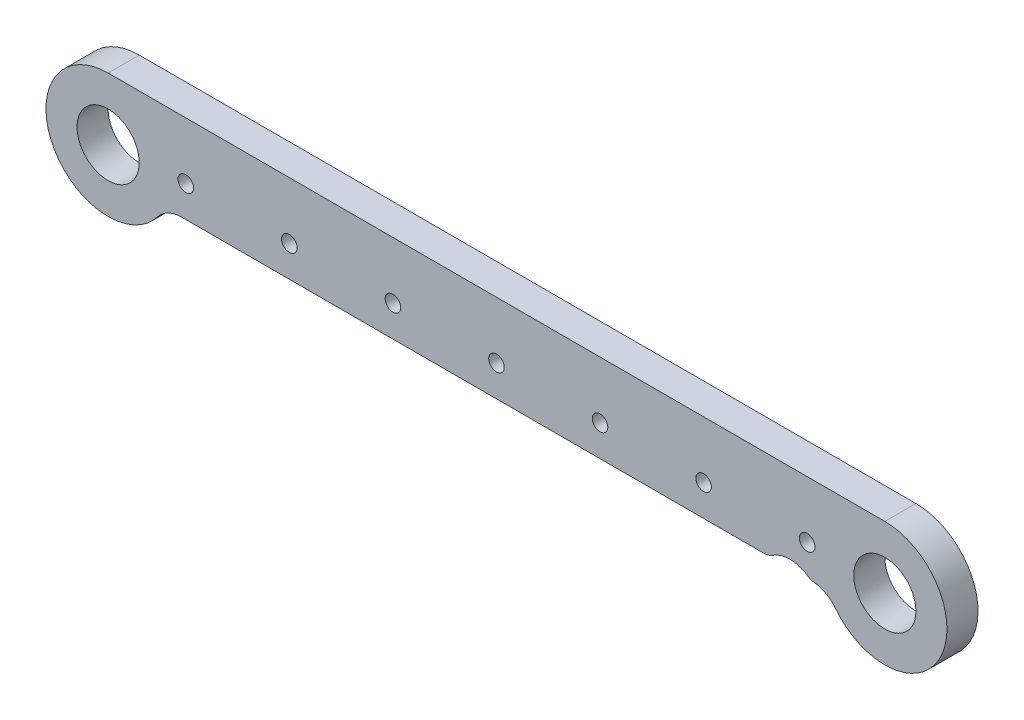
ISO-10303-21;
HEADER;
FILE_DESCRIPTION(('STEP AP214'),'2;1');
FILE_NAME('part.step','',(''),(''),'','','');
FILE_SCHEMA(('AUTOMOTIVE_DESIGN { 1 0 10303 214 1 1 1 1 }'));
ENDSEC;
DATA;
#1=APPLICATION_CONTEXT('core data for automotive mechanical design processes');
#2=APPLICATION_PROTOCOL_DEFINITION('international standard','automotive_design',2000,#1);
#3=PRODUCT_CONTEXT('',#1,'mechanical');
#4=PRODUCT('Part','Part','',(#3));
#5=PRODUCT_RELATED_PRODUCT_CATEGORY('part','',(#4));
#6=PRODUCT_DEFINITION_FORMATION('','',#4);
#7=PRODUCT_DEFINITION_CONTEXT('part definition',#1,'design');
#8=PRODUCT_DEFINITION('design','',#6,#7);
#9=PRODUCT_DEFINITION_SHAPE('','',#8);
#10=(LENGTH_UNIT() NAMED_UNIT(*) SI_UNIT(.MILLI.,.METRE.));
#11=(NAMED_UNIT(*) PLANE_ANGLE_UNIT() SI_UNIT($,.RADIAN.));
#12=(NAMED_UNIT(*) SI_UNIT($,.STERADIAN.) SOLID_ANGLE_UNIT());
#13=UNCERTAINTY_MEASURE_WITH_UNIT(LENGTH_MEASURE(1.E-05),#10,'distance_accuracy_value','');
#14=(GEOMETRIC_REPRESENTATION_CONTEXT(3) GLOBAL_UNCERTAINTY_ASSIGNED_CONTEXT((#13)) GLOBAL_UNIT_ASSIGNED_CONTEXT((#10,
#11,#12)) REPRESENTATION_CONTEXT('',''));
#15=CARTESIAN_POINT('',(0.,0.,0.));
#16=DIRECTION('',(0.,0.,1.));
#17=DIRECTION('',(1.,0.,0.));
#18=AXIS2_PLACEMENT_3D('',#15,#16,#17);
#19=CARTESIAN_POINT('',(0.,0.,6.));
#20=DIRECTION('',(0.,0.,1.));
#21=DIRECTION('',(1.,0.,0.));
#22=AXIS2_PLACEMENT_3D('',#19,#20,#21);
#23=PLANE('',#22);
#24=DIRECTION('',(-1.,0.,0.));
#25=VECTOR('',#24,1.);
#26=CARTESIAN_POINT('',(0.,-4.99999999999998,6.));
#27=LINE('',#26,#25);
#28=CARTESIAN_POINT('',(126.695624403339,-4.99999999999997,6.));
#29=VERTEX_POINT('',#28);
#30=CARTESIAN_POINT('',(14.247806848775,-4.99999999999998,6.));
#31=VERTEX_POINT('',#30);
#32=EDGE_CURVE('E185',#29,#31,#27,.T.);
#33=ORIENTED_EDGE('',*,*,#32,.F.);
#34=CARTESIAN_POINT('',(126.695624403339,-1.99999999999997,6.));
#35=DIRECTION('',(0.,0.,1.));
#36=DIRECTION('',(1.,0.,0.));
#37=AXIS2_PLACEMENT_3D('',#34,#35,#36);
#38=CIRCLE('',#37,3.);
#39=CARTESIAN_POINT('',(128.361802672633,-4.49476451292152,6.));
#40=VERTEX_POINT('',#39);
#41=EDGE_CURVE('E190',#29,#40,#38,.T.);
#42=ORIENTED_EDGE('',*,*,#41,.T.);
#43=CARTESIAN_POINT('',(131.69415921122,-9.48429353876468,6.));
#44=DIRECTION('',(0.,0.,1.));
#45=DIRECTION('',(1.,0.,0.));
#46=AXIS2_PLACEMENT_3D('',#43,#44,#45);
#47=CIRCLE('',#46,6.00000000000002);
#48=CARTESIAN_POINT('',(135.084520369781,-4.53399544526351,6.));
#49=VERTEX_POINT('',#48);
#50=EDGE_CURVE('E213',#49,#40,#47,.T.);
#51=ORIENTED_EDGE('',*,*,#50,.F.);
#52=CARTESIAN_POINT('',(136.779700949062,-2.05884639851294,6.));
#53=DIRECTION('',(0.,0.,1.));
#54=DIRECTION('',(1.,0.,0.));
#55=AXIS2_PLACEMENT_3D('',#52,#53,#54);
#56=CIRCLE('',#55,3.);
#57=CARTESIAN_POINT('',(136.437198349783,-5.03923093234195,6.));
#58=VERTEX_POINT('',#57);
#59=EDGE_CURVE('E188',#49,#58,#56,.T.);
#60=ORIENTED_EDGE('',*,*,#59,.T.);
#61=CARTESIAN_POINT('',(135.752193151225,-11.,6.));
#62=DIRECTION('',(0.,0.,1.));
#63=DIRECTION('',(1.,0.,0.));
#64=AXIS2_PLACEMENT_3D('',#61,#62,#63);
#65=CIRCLE('',#64,6.);
#66=CARTESIAN_POINT('',(140.501462100817,-7.33333333333332,6.));
#67=VERTEX_POINT('',#66);
#68=EDGE_CURVE('E118',#58,#67,#65,.F.);
#69=ORIENTED_EDGE('',*,*,#68,.T.);
#70=CARTESIAN_POINT('',(150.,0.,6.));
#71=DIRECTION('',(0.,0.,1.));
#72=DIRECTION('',(1.,0.,0.));
#73=AXIS2_PLACEMENT_3D('',#70,#71,#72);
#74=CIRCLE('',#73,12.);
#75=CARTESIAN_POINT('',(150.,12.,6.));
#76=VERTEX_POINT('',#75);
#77=EDGE_CURVE('E109',#67,#76,#74,.T.);
#78=ORIENTED_EDGE('',*,*,#77,.T.);
#79=DIRECTION('',(-1.,0.,0.));
#80=VECTOR('',#79,1.);
#81=CARTESIAN_POINT('',(0.,12.,6.));
#82=LINE('',#81,#80);
#83=CARTESIAN_POINT('',(0.,12.,6.));
#84=VERTEX_POINT('',#83);
#85=EDGE_CURVE('E115',#76,#84,#82,.T.);
#86=ORIENTED_EDGE('',*,*,#85,.T.);
#87=CARTESIAN_POINT('',(0.,0.,6.));
#88=DIRECTION('',(0.,0.,1.));
#89=DIRECTION('',(1.,0.,0.));
#90=AXIS2_PLACEMENT_3D('',#87,#88,#89);
#91=CIRCLE('',#90,12.);
#92=CARTESIAN_POINT('',(9.49853789918335,-7.33333333333332,6.));
#93=VERTEX_POINT('',#92);
#94=EDGE_CURVE('E121',#84,#93,#91,.T.);
#95=ORIENTED_EDGE('',*,*,#94,.T.);
#96=CARTESIAN_POINT('',(14.247806848775,-11.,6.));
#97=DIRECTION('',(0.,0.,1.));
#98=DIRECTION('',(1.,0.,0.));
#99=AXIS2_PLACEMENT_3D('',#96,#97,#98);
#100=CIRCLE('',#99,6.);
#101=EDGE_CURVE('E157',#93,#31,#100,.F.);
#102=ORIENTED_EDGE('',*,*,#101,.T.);
#103=EDGE_LOOP('',(#33,#42,#51,#60,#69,#78,#86,#95,#102));
#104=FACE_BOUND('',#103,.T.);
#105=CARTESIAN_POINT('',(15.,1.00000000000003,6.));
#106=DIRECTION('',(0.,0.,1.));
#107=DIRECTION('',(1.,0.,0.));
#108=AXIS2_PLACEMENT_3D('',#105,#106,#107);
#109=CIRCLE('',#108,1.5);
#110=CARTESIAN_POINT('',(16.5,1.00000000000003,6.));
#111=VERTEX_POINT('',#110);
#112=EDGE_CURVE('E167',#111,#111,#109,.T.);
#113=ORIENTED_EDGE('',*,*,#112,.F.);
#114=EDGE_LOOP('',(#113));
#115=FACE_BOUND('',#114,.T.);
#116=CARTESIAN_POINT('',(35.,1.00000000000003,6.));
#117=DIRECTION('',(0.,0.,1.));
#118=DIRECTION('',(1.,0.,0.));
#119=AXIS2_PLACEMENT_3D('',#116,#117,#118);
#120=CIRCLE('',#119,1.5);
#121=CARTESIAN_POINT('',(36.5,1.00000000000003,6.));
#122=VERTEX_POINT('',#121);
#123=EDGE_CURVE('E226',#122,#122,#120,.T.);
#124=ORIENTED_EDGE('',*,*,#123,.F.);
#125=EDGE_LOOP('',(#124));
#126=FACE_BOUND('',#125,.T.);
#127=CARTESIAN_POINT('',(55.,1.00000000000003,6.));
#128=DIRECTION('',(0.,0.,1.));
#129=DIRECTION('',(1.,0.,0.));
#130=AXIS2_PLACEMENT_3D('',#127,#128,#129);
#131=CIRCLE('',#130,1.5);
#132=CARTESIAN_POINT('',(56.5,1.00000000000003,6.));
#133=VERTEX_POINT('',#132);
#134=EDGE_CURVE('E229',#133,#133,#131,.T.);
#135=ORIENTED_EDGE('',*,*,#134,.F.);
#136=EDGE_LOOP('',(#135));
#137=FACE_BOUND('',#136,.T.);
#138=CARTESIAN_POINT('',(75.,1.00000000000003,6.));
#139=DIRECTION('',(0.,0.,1.));
#140=DIRECTION('',(1.,0.,0.));
#141=AXIS2_PLACEMENT_3D('',#138,#139,#140);
#142=CIRCLE('',#141,1.5);
#143=CARTESIAN_POINT('',(76.5,1.00000000000003,6.));
#144=VERTEX_POINT('',#143);
#145=EDGE_CURVE('E232',#144,#144,#142,.T.);
#146=ORIENTED_EDGE('',*,*,#145,.F.);
#147=EDGE_LOOP('',(#146));
#148=FACE_BOUND('',#147,.T.);
#149=CARTESIAN_POINT('',(95.,1.00000000000003,6.));
#150=DIRECTION('',(0.,0.,1.));
#151=DIRECTION('',(1.,0.,0.));
#152=AXIS2_PLACEMENT_3D('',#149,#150,#151);
#153=CIRCLE('',#152,1.5);
#154=CARTESIAN_POINT('',(96.5,1.00000000000003,6.));
#155=VERTEX_POINT('',#154);
#156=EDGE_CURVE('E235',#155,#155,#153,.T.);
#157=ORIENTED_EDGE('',*,*,#156,.F.);
#158=EDGE_LOOP('',(#157));
#159=FACE_BOUND('',#158,.T.);
#160=CARTESIAN_POINT('',(115.,1.00000000000003,6.));
#161=DIRECTION('',(0.,0.,1.));
#162=DIRECTION('',(1.,0.,0.));
#163=AXIS2_PLACEMENT_3D('',#160,#161,#162);
#164=CIRCLE('',#163,1.50000000000001);
#165=CARTESIAN_POINT('',(116.5,1.00000000000003,6.));
#166=VERTEX_POINT('',#165);
#167=EDGE_CURVE('E220',#166,#166,#164,.T.);
#168=ORIENTED_EDGE('',*,*,#167,.F.);
#169=EDGE_LOOP('',(#168));
#170=FACE_BOUND('',#169,.T.);
#171=CARTESIAN_POINT('',(135.,1.00000000000003,6.));
#172=DIRECTION('',(0.,0.,1.));
#173=DIRECTION('',(1.,0.,0.));
#174=AXIS2_PLACEMENT_3D('',#171,#172,#173);
#175=CIRCLE('',#174,1.5);
#176=CARTESIAN_POINT('',(136.5,1.00000000000003,6.));
#177=VERTEX_POINT('',#176);
#178=EDGE_CURVE('E217',#177,#177,#175,.T.);
#179=ORIENTED_EDGE('',*,*,#178,.F.);
#180=EDGE_LOOP('',(#179));
#181=FACE_BOUND('',#180,.T.);
#182=CARTESIAN_POINT('',(0.,0.,6.));
#183=DIRECTION('',(0.,0.,1.));
#184=DIRECTION('',(1.,0.,0.));
#185=AXIS2_PLACEMENT_3D('',#182,#183,#184);
#186=CIRCLE('',#185,6.);
#187=CARTESIAN_POINT('',(6.,0.,6.));
#188=VERTEX_POINT('',#187);
#189=EDGE_CURVE('E143',#188,#188,#186,.T.);
#190=ORIENTED_EDGE('',*,*,#189,.F.);
#191=EDGE_LOOP('',(#190));
#192=FACE_BOUND('',#191,.T.);
#193=CARTESIAN_POINT('',(150.,0.,6.));
#194=DIRECTION('',(0.,0.,1.));
#195=DIRECTION('',(1.,0.,0.));
#196=AXIS2_PLACEMENT_3D('',#193,#194,#195);
#197=CIRCLE('',#196,6.00000000000002);
#198=CARTESIAN_POINT('',(156.,0.,6.));
#199=VERTEX_POINT('',#198);
#200=EDGE_CURVE('E241',#199,#199,#197,.T.);
#201=ORIENTED_EDGE('',*,*,#200,.F.);
#202=EDGE_LOOP('',(#201));
#203=FACE_BOUND('',#202,.T.);
#204=ADVANCED_FACE('F39',(#104,#115,#126,#137,#148,#159,#170,#181,#192,#203),#23,.T.);
#205=CARTESIAN_POINT('',(0.,0.,0.));
#206=DIRECTION('',(0.,0.,1.));
#207=DIRECTION('',(1.,0.,0.));
#208=AXIS2_PLACEMENT_3D('',#205,#206,#207);
#209=PLANE('',#208);
#210=CARTESIAN_POINT('',(15.,1.00000000000003,0.));
#211=DIRECTION('',(0.,0.,1.));
#212=DIRECTION('',(1.,0.,0.));
#213=AXIS2_PLACEMENT_3D('',#210,#211,#212);
#214=CIRCLE('',#213,1.5);
#215=CARTESIAN_POINT('',(16.5,1.00000000000003,0.));
#216=VERTEX_POINT('',#215);
#217=EDGE_CURVE('E182',#216,#216,#214,.T.);
#218=ORIENTED_EDGE('',*,*,#217,.T.);
#219=EDGE_LOOP('',(#218));
#220=FACE_BOUND('',#219,.T.);
#221=CARTESIAN_POINT('',(35.,1.00000000000003,0.));
#222=DIRECTION('',(0.,0.,1.));
#223=DIRECTION('',(1.,0.,0.));
#224=AXIS2_PLACEMENT_3D('',#221,#222,#223);
#225=CIRCLE('',#224,1.5);
#226=CARTESIAN_POINT('',(36.5,1.00000000000003,0.));
#227=VERTEX_POINT('',#226);
#228=EDGE_CURVE('E179',#227,#227,#225,.T.);
#229=ORIENTED_EDGE('',*,*,#228,.T.);
#230=EDGE_LOOP('',(#229));
#231=FACE_BOUND('',#230,.T.);
#232=CARTESIAN_POINT('',(55.,1.00000000000003,0.));
#233=DIRECTION('',(0.,0.,1.));
#234=DIRECTION('',(1.,0.,0.));
#235=AXIS2_PLACEMENT_3D('',#232,#233,#234);
#236=CIRCLE('',#235,1.5);
#237=CARTESIAN_POINT('',(56.5,1.00000000000003,0.));
#238=VERTEX_POINT('',#237);
#239=EDGE_CURVE('E176',#238,#238,#236,.T.);
#240=ORIENTED_EDGE('',*,*,#239,.T.);
#241=EDGE_LOOP('',(#240));
#242=FACE_BOUND('',#241,.T.);
#243=CARTESIAN_POINT('',(75.,1.00000000000003,0.));
#244=DIRECTION('',(0.,0.,1.));
#245=DIRECTION('',(1.,0.,0.));
#246=AXIS2_PLACEMENT_3D('',#243,#244,#245);
#247=CIRCLE('',#246,1.5);
#248=CARTESIAN_POINT('',(76.5,1.00000000000003,0.));
#249=VERTEX_POINT('',#248);
#250=EDGE_CURVE('E173',#249,#249,#247,.T.);
#251=ORIENTED_EDGE('',*,*,#250,.T.);
#252=EDGE_LOOP('',(#251));
#253=FACE_BOUND('',#252,.T.);
#254=CARTESIAN_POINT('',(95.,1.00000000000003,0.));
#255=DIRECTION('',(0.,0.,1.));
#256=DIRECTION('',(1.,0.,0.));
#257=AXIS2_PLACEMENT_3D('',#254,#255,#256);
#258=CIRCLE('',#257,1.5);
#259=CARTESIAN_POINT('',(96.5,1.00000000000003,0.));
#260=VERTEX_POINT('',#259);
#261=EDGE_CURVE('E170',#260,#260,#258,.T.);
#262=ORIENTED_EDGE('',*,*,#261,.T.);
#263=EDGE_LOOP('',(#262));
#264=FACE_BOUND('',#263,.T.);
#265=CARTESIAN_POINT('',(115.,1.00000000000003,0.));
#266=DIRECTION('',(0.,0.,1.));
#267=DIRECTION('',(1.,0.,0.));
#268=AXIS2_PLACEMENT_3D('',#265,#266,#267);
#269=CIRCLE('',#268,1.50000000000001);
#270=CARTESIAN_POINT('',(116.5,1.00000000000003,0.));
#271=VERTEX_POINT('',#270);
#272=EDGE_CURVE('E166',#271,#271,#269,.T.);
#273=ORIENTED_EDGE('',*,*,#272,.T.);
#274=EDGE_LOOP('',(#273));
#275=FACE_BOUND('',#274,.T.);
#276=CARTESIAN_POINT('',(135.,1.00000000000003,0.));
#277=DIRECTION('',(0.,0.,1.));
#278=DIRECTION('',(1.,0.,0.));
#279=AXIS2_PLACEMENT_3D('',#276,#277,#278);
#280=CIRCLE('',#279,1.5);
#281=CARTESIAN_POINT('',(136.5,1.00000000000003,0.));
#282=VERTEX_POINT('',#281);
#283=EDGE_CURVE('E163',#282,#282,#280,.T.);
#284=ORIENTED_EDGE('',*,*,#283,.T.);
#285=EDGE_LOOP('',(#284));
#286=FACE_BOUND('',#285,.T.);
#287=CARTESIAN_POINT('',(150.,0.,0.));
#288=DIRECTION('',(0.,0.,1.));
#289=DIRECTION('',(1.,0.,0.));
#290=AXIS2_PLACEMENT_3D('',#287,#288,#289);
#291=CIRCLE('',#290,6.00000000000002);
#292=CARTESIAN_POINT('',(156.,0.,0.));
#293=VERTEX_POINT('',#292);
#294=EDGE_CURVE('E208',#293,#293,#291,.T.);
#295=ORIENTED_EDGE('',*,*,#294,.T.);
#296=EDGE_LOOP('',(#295));
#297=FACE_BOUND('',#296,.T.);
#298=CARTESIAN_POINT('',(0.,0.,0.));
#299=DIRECTION('',(0.,0.,1.));
#300=DIRECTION('',(1.,0.,0.));
#301=AXIS2_PLACEMENT_3D('',#298,#299,#300);
#302=CIRCLE('',#301,6.);
#303=CARTESIAN_POINT('',(6.,0.,0.));
#304=VERTEX_POINT('',#303);
#305=EDGE_CURVE('E244',#304,#304,#302,.T.);
#306=ORIENTED_EDGE('',*,*,#305,.T.);
#307=EDGE_LOOP('',(#306));
#308=FACE_BOUND('',#307,.T.);
#309=CARTESIAN_POINT('',(131.69415921122,-9.48429353876468,0.));
#310=DIRECTION('',(0.,0.,-1.));
#311=DIRECTION('',(-1.,0.,0.));
#312=AXIS2_PLACEMENT_3D('',#309,#310,#311);
#313=CIRCLE('',#312,6.00000000000002);
#314=CARTESIAN_POINT('',(128.361802672633,-4.49476451292152,0.));
#315=VERTEX_POINT('',#314);
#316=CARTESIAN_POINT('',(135.084520369781,-4.53399544526351,0.));
#317=VERTEX_POINT('',#316);
#318=EDGE_CURVE('E200',#315,#317,#313,.T.);
#319=ORIENTED_EDGE('',*,*,#318,.F.);
#320=CARTESIAN_POINT('',(126.695624403339,-1.99999999999997,0.));
#321=DIRECTION('',(0.,0.,1.));
#322=DIRECTION('',(1.,0.,0.));
#323=AXIS2_PLACEMENT_3D('',#320,#321,#322);
#324=CIRCLE('',#323,3.);
#325=CARTESIAN_POINT('',(126.695624403339,-4.99999999999997,0.));
#326=VERTEX_POINT('',#325);
#327=EDGE_CURVE('E47',#315,#326,#324,.F.);
#328=ORIENTED_EDGE('',*,*,#327,.T.);
#329=DIRECTION('',(-1.,0.,0.));
#330=VECTOR('',#329,1.);
#331=CARTESIAN_POINT('',(0.,-4.99999999999998,0.));
#332=LINE('',#331,#330);
#333=CARTESIAN_POINT('',(14.247806848775,-4.99999999999998,0.));
#334=VERTEX_POINT('',#333);
#335=EDGE_CURVE('E199',#326,#334,#332,.T.);
#336=ORIENTED_EDGE('',*,*,#335,.T.);
#337=CARTESIAN_POINT('',(14.247806848775,-11.,0.));
#338=DIRECTION('',(0.,0.,1.));
#339=DIRECTION('',(1.,0.,0.));
#340=AXIS2_PLACEMENT_3D('',#337,#338,#339);
#341=CIRCLE('',#340,6.);
#342=CARTESIAN_POINT('',(9.49853789918335,-7.33333333333332,0.));
#343=VERTEX_POINT('',#342);
#344=EDGE_CURVE('E160',#334,#343,#341,.T.);
#345=ORIENTED_EDGE('',*,*,#344,.T.);
#346=CARTESIAN_POINT('',(0.,0.,0.));
#347=DIRECTION('',(0.,0.,1.));
#348=DIRECTION('',(1.,0.,0.));
#349=AXIS2_PLACEMENT_3D('',#346,#347,#348);
#350=CIRCLE('',#349,12.);
#351=CARTESIAN_POINT('',(0.,12.,0.));
#352=VERTEX_POINT('',#351);
#353=EDGE_CURVE('E140',#352,#343,#350,.T.);
#354=ORIENTED_EDGE('',*,*,#353,.F.);
#355=DIRECTION('',(-1.,0.,0.));
#356=VECTOR('',#355,1.);
#357=CARTESIAN_POINT('',(0.,12.,0.));
#358=LINE('',#357,#356);
#359=CARTESIAN_POINT('',(150.,12.,0.));
#360=VERTEX_POINT('',#359);
#361=EDGE_CURVE('E145',#360,#352,#358,.T.);
#362=ORIENTED_EDGE('',*,*,#361,.F.);
#363=CARTESIAN_POINT('',(150.,0.,0.));
#364=DIRECTION('',(0.,0.,1.));
#365=DIRECTION('',(1.,0.,0.));
#366=AXIS2_PLACEMENT_3D('',#363,#364,#365);
#367=CIRCLE('',#366,12.);
#368=CARTESIAN_POINT('',(140.501462100817,-7.33333333333332,0.));
#369=VERTEX_POINT('',#368);
#370=EDGE_CURVE('E127',#369,#360,#367,.T.);
#371=ORIENTED_EDGE('',*,*,#370,.F.);
#372=CARTESIAN_POINT('',(135.752193151225,-11.,0.));
#373=DIRECTION('',(0.,0.,1.));
#374=DIRECTION('',(1.,0.,0.));
#375=AXIS2_PLACEMENT_3D('',#372,#373,#374);
#376=CIRCLE('',#375,6.);
#377=CARTESIAN_POINT('',(136.437198349783,-5.03923093234195,0.));
#378=VERTEX_POINT('',#377);
#379=EDGE_CURVE('E155',#369,#378,#376,.T.);
#380=ORIENTED_EDGE('',*,*,#379,.T.);
#381=CARTESIAN_POINT('',(136.779700949062,-2.05884639851294,0.));
#382=DIRECTION('',(0.,0.,1.));
#383=DIRECTION('',(1.,0.,0.));
#384=AXIS2_PLACEMENT_3D('',#381,#382,#383);
#385=CIRCLE('',#384,3.);
#386=EDGE_CURVE('E54',#378,#317,#385,.F.);
#387=ORIENTED_EDGE('',*,*,#386,.T.);
#388=EDGE_LOOP('',(#319,#328,#336,#345,#354,#362,#371,#380,#387));
#389=FACE_BOUND('',#388,.T.);
#390=ADVANCED_FACE('F198',(#220,#231,#242,#253,#264,#275,#286,#297,#308,#389),#209,.F.);
#391=CARTESIAN_POINT('',(0.,0.,6.));
#392=DIRECTION('',(0.,0.,-1.));
#393=DIRECTION('',(-1.,0.,0.));
#394=AXIS2_PLACEMENT_3D('',#391,#392,#393);
#395=CYLINDRICAL_SURFACE('',#394,12.);
#396=ORIENTED_EDGE('',*,*,#353,.T.);
#397=DIRECTION('',(0.,0.,-1.));
#398=VECTOR('',#397,1.);
#399=CARTESIAN_POINT('',(9.49853789918335,-7.33333333333332,6.));
#400=LINE('',#399,#398);
#401=EDGE_CURVE('E151',#343,#93,#400,.F.);
#402=ORIENTED_EDGE('',*,*,#401,.T.);
#403=ORIENTED_EDGE('',*,*,#94,.F.);
#404=DIRECTION('',(0.,0.,-1.));
#405=VECTOR('',#404,1.);
#406=CARTESIAN_POINT('',(0.,12.,6.));
#407=LINE('',#406,#405);
#408=EDGE_CURVE('E131',#84,#352,#407,.T.);
#409=ORIENTED_EDGE('',*,*,#408,.T.);
#410=EDGE_LOOP('',(#396,#402,#403,#409));
#411=FACE_BOUND('',#410,.T.);
#412=ADVANCED_FACE('F251',(#411),#395,.T.);
#413=CARTESIAN_POINT('',(150.,0.,6.));
#414=DIRECTION('',(0.,0.,-1.));
#415=DIRECTION('',(-1.,0.,0.));
#416=AXIS2_PLACEMENT_3D('',#413,#414,#415);
#417=CYLINDRICAL_SURFACE('',#416,12.);
#418=ORIENTED_EDGE('',*,*,#77,.F.);
#419=DIRECTION('',(0.,0.,-1.));
#420=VECTOR('',#419,1.);
#421=CARTESIAN_POINT('',(140.501462100817,-7.33333333333332,6.));
#422=LINE('',#421,#420);
#423=EDGE_CURVE('E149',#67,#369,#422,.T.);
#424=ORIENTED_EDGE('',*,*,#423,.T.);
#425=ORIENTED_EDGE('',*,*,#370,.T.);
#426=DIRECTION('',(0.,0.,-1.));
#427=VECTOR('',#426,1.);
#428=CARTESIAN_POINT('',(150.,12.,6.));
#429=LINE('',#428,#427);
#430=EDGE_CURVE('E124',#76,#360,#429,.T.);
#431=ORIENTED_EDGE('',*,*,#430,.F.);
#432=EDGE_LOOP('',(#418,#424,#425,#431));
#433=FACE_BOUND('',#432,.T.);
#434=ADVANCED_FACE('F125',(#433),#417,.T.);
#435=CARTESIAN_POINT('',(0.,12.,6.));
#436=DIRECTION('',(0.,-1.,0.));
#437=DIRECTION('',(0.,0.,-1.));
#438=AXIS2_PLACEMENT_3D('',#435,#436,#437);
#439=PLANE('',#438);
#440=ORIENTED_EDGE('',*,*,#361,.T.);
#441=ORIENTED_EDGE('',*,*,#408,.F.);
#442=ORIENTED_EDGE('',*,*,#85,.F.);
#443=ORIENTED_EDGE('',*,*,#430,.T.);
#444=EDGE_LOOP('',(#440,#441,#442,#443));
#445=FACE_BOUND('',#444,.T.);
#446=ADVANCED_FACE('F133',(#445),#439,.F.);
#447=CARTESIAN_POINT('',(0.,0.,6.));
#448=DIRECTION('',(0.,0.,-1.));
#449=DIRECTION('',(-1.,0.,0.));
#450=AXIS2_PLACEMENT_3D('',#447,#448,#449);
#451=CYLINDRICAL_SURFACE('',#450,6.);
#452=ORIENTED_EDGE('',*,*,#189,.T.);
#453=EDGE_LOOP('',(#452));
#454=FACE_BOUND('',#453,.T.);
#455=ORIENTED_EDGE('',*,*,#305,.F.);
#456=EDGE_LOOP('',(#455));
#457=FACE_BOUND('',#456,.T.);
#458=ADVANCED_FACE('F271',(#454,#457),#451,.F.);
#459=CARTESIAN_POINT('',(150.,0.,6.));
#460=DIRECTION('',(0.,0.,-1.));
#461=DIRECTION('',(-1.,0.,0.));
#462=AXIS2_PLACEMENT_3D('',#459,#460,#461);
#463=CYLINDRICAL_SURFACE('',#462,6.00000000000002);
#464=ORIENTED_EDGE('',*,*,#200,.T.);
#465=EDGE_LOOP('',(#464));
#466=FACE_BOUND('',#465,.T.);
#467=ORIENTED_EDGE('',*,*,#294,.F.);
#468=EDGE_LOOP('',(#467));
#469=FACE_BOUND('',#468,.T.);
#470=ADVANCED_FACE('F300',(#466,#469),#463,.F.);
#471=CARTESIAN_POINT('',(0.,-4.99999999999998,0.));
#472=DIRECTION('',(0.,1.,0.));
#473=DIRECTION('',(-1.,0.,0.));
#474=AXIS2_PLACEMENT_3D('',#471,#472,#473);
#475=PLANE('',#474);
#476=ORIENTED_EDGE('',*,*,#335,.F.);
#477=DIRECTION('',(0.,0.,-1.));
#478=VECTOR('',#477,1.);
#479=CARTESIAN_POINT('',(126.695624403339,-4.99999999999997,0.));
#480=LINE('',#479,#478);
#481=EDGE_CURVE('E162',#326,#29,#480,.F.);
#482=ORIENTED_EDGE('',*,*,#481,.T.);
#483=ORIENTED_EDGE('',*,*,#32,.T.);
#484=DIRECTION('',(0.,0.,1.));
#485=VECTOR('',#484,1.);
#486=CARTESIAN_POINT('',(14.247806848775,-4.99999999999998,0.));
#487=LINE('',#486,#485);
#488=EDGE_CURVE('E130',#31,#334,#487,.F.);
#489=ORIENTED_EDGE('',*,*,#488,.T.);
#490=EDGE_LOOP('',(#476,#482,#483,#489));
#491=FACE_BOUND('',#490,.T.);
#492=ADVANCED_FACE('F205',(#491),#475,.F.);
#493=CARTESIAN_POINT('',(135.752193151225,-11.,6.));
#494=DIRECTION('',(0.,0.,-1.));
#495=DIRECTION('',(-1.,0.,0.));
#496=AXIS2_PLACEMENT_3D('',#493,#494,#495);
#497=CYLINDRICAL_SURFACE('',#496,6.);
#498=ORIENTED_EDGE('',*,*,#68,.F.);
#499=DIRECTION('',(0.,0.,-1.));
#500=VECTOR('',#499,1.);
#501=CARTESIAN_POINT('',(136.437198349783,-5.03923093234195,6.));
#502=LINE('',#501,#500);
#503=EDGE_CURVE('E11',#58,#378,#502,.T.);
#504=ORIENTED_EDGE('',*,*,#503,.T.);
#505=ORIENTED_EDGE('',*,*,#379,.F.);
#506=ORIENTED_EDGE('',*,*,#423,.F.);
#507=EDGE_LOOP('',(#498,#504,#505,#506));
#508=FACE_BOUND('',#507,.T.);
#509=ADVANCED_FACE('F258',(#508),#497,.F.);
#510=CARTESIAN_POINT('',(14.247806848775,-11.,6.));
#511=DIRECTION('',(0.,0.,-1.));
#512=DIRECTION('',(-1.,0.,0.));
#513=AXIS2_PLACEMENT_3D('',#510,#511,#512);
#514=CYLINDRICAL_SURFACE('',#513,6.);
#515=ORIENTED_EDGE('',*,*,#344,.F.);
#516=ORIENTED_EDGE('',*,*,#488,.F.);
#517=ORIENTED_EDGE('',*,*,#101,.F.);
#518=ORIENTED_EDGE('',*,*,#401,.F.);
#519=EDGE_LOOP('',(#515,#516,#517,#518));
#520=FACE_BOUND('',#519,.T.);
#521=ADVANCED_FACE('F255',(#520),#514,.F.);
#522=CARTESIAN_POINT('',(135.,1.00000000000003,-4.));
#523=DIRECTION('',(0.,0.,1.));
#524=DIRECTION('',(1.,0.,0.));
#525=AXIS2_PLACEMENT_3D('',#522,#523,#524);
#526=CYLINDRICAL_SURFACE('',#525,1.5);
#527=ORIENTED_EDGE('',*,*,#178,.T.);
#528=EDGE_LOOP('',(#527));
#529=FACE_BOUND('',#528,.T.);
#530=ORIENTED_EDGE('',*,*,#283,.F.);
#531=EDGE_LOOP('',(#530));
#532=FACE_BOUND('',#531,.T.);
#533=ADVANCED_FACE('F283',(#529,#532),#526,.F.);
#534=CARTESIAN_POINT('',(115.,1.00000000000003,-4.));
#535=DIRECTION('',(0.,0.,1.));
#536=DIRECTION('',(1.,0.,0.));
#537=AXIS2_PLACEMENT_3D('',#534,#535,#536);
#538=CYLINDRICAL_SURFACE('',#537,1.50000000000001);
#539=ORIENTED_EDGE('',*,*,#167,.T.);
#540=EDGE_LOOP('',(#539));
#541=FACE_BOUND('',#540,.T.);
#542=ORIENTED_EDGE('',*,*,#272,.F.);
#543=EDGE_LOOP('',(#542));
#544=FACE_BOUND('',#543,.T.);
#545=ADVANCED_FACE('F287',(#541,#544),#538,.F.);
#546=CARTESIAN_POINT('',(95.,1.00000000000003,-4.));
#547=DIRECTION('',(0.,0.,1.));
#548=DIRECTION('',(1.,0.,0.));
#549=AXIS2_PLACEMENT_3D('',#546,#547,#548);
#550=CYLINDRICAL_SURFACE('',#549,1.5);
#551=ORIENTED_EDGE('',*,*,#156,.T.);
#552=EDGE_LOOP('',(#551));
#553=FACE_BOUND('',#552,.T.);
#554=ORIENTED_EDGE('',*,*,#261,.F.);
#555=EDGE_LOOP('',(#554));
#556=FACE_BOUND('',#555,.T.);
#557=ADVANCED_FACE('F293',(#553,#556),#550,.F.);
#558=CARTESIAN_POINT('',(75.,1.00000000000003,-4.));
#559=DIRECTION('',(0.,0.,1.));
#560=DIRECTION('',(1.,0.,0.));
#561=AXIS2_PLACEMENT_3D('',#558,#559,#560);
#562=CYLINDRICAL_SURFACE('',#561,1.5);
#563=ORIENTED_EDGE('',*,*,#145,.T.);
#564=EDGE_LOOP('',(#563));
#565=FACE_BOUND('',#564,.T.);
#566=ORIENTED_EDGE('',*,*,#250,.F.);
#567=EDGE_LOOP('',(#566));
#568=FACE_BOUND('',#567,.T.);
#569=ADVANCED_FACE('F407',(#565,#568),#562,.F.);
#570=CARTESIAN_POINT('',(55.,1.00000000000003,-4.));
#571=DIRECTION('',(0.,0.,1.));
#572=DIRECTION('',(1.,0.,0.));
#573=AXIS2_PLACEMENT_3D('',#570,#571,#572);
#574=CYLINDRICAL_SURFACE('',#573,1.5);
#575=ORIENTED_EDGE('',*,*,#134,.T.);
#576=EDGE_LOOP('',(#575));
#577=FACE_BOUND('',#576,.T.);
#578=ORIENTED_EDGE('',*,*,#239,.F.);
#579=EDGE_LOOP('',(#578));
#580=FACE_BOUND('',#579,.T.);
#581=ADVANCED_FACE('F397',(#577,#580),#574,.F.);
#582=CARTESIAN_POINT('',(35.,1.00000000000003,-4.));
#583=DIRECTION('',(0.,0.,1.));
#584=DIRECTION('',(1.,0.,0.));
#585=AXIS2_PLACEMENT_3D('',#582,#583,#584);
#586=CYLINDRICAL_SURFACE('',#585,1.5);
#587=ORIENTED_EDGE('',*,*,#123,.T.);
#588=EDGE_LOOP('',(#587));
#589=FACE_BOUND('',#588,.T.);
#590=ORIENTED_EDGE('',*,*,#228,.F.);
#591=EDGE_LOOP('',(#590));
#592=FACE_BOUND('',#591,.T.);
#593=ADVANCED_FACE('F388',(#589,#592),#586,.F.);
#594=CARTESIAN_POINT('',(15.,1.00000000000003,-4.));
#595=DIRECTION('',(0.,0.,1.));
#596=DIRECTION('',(1.,0.,0.));
#597=AXIS2_PLACEMENT_3D('',#594,#595,#596);
#598=CYLINDRICAL_SURFACE('',#597,1.5);
#599=ORIENTED_EDGE('',*,*,#112,.T.);
#600=EDGE_LOOP('',(#599));
#601=FACE_BOUND('',#600,.T.);
#602=ORIENTED_EDGE('',*,*,#217,.F.);
#603=EDGE_LOOP('',(#602));
#604=FACE_BOUND('',#603,.T.);
#605=ADVANCED_FACE('F363',(#601,#604),#598,.F.);
#606=CARTESIAN_POINT('',(131.69415921122,-9.48429353876468,10.));
#607=DIRECTION('',(0.,0.,-1.));
#608=DIRECTION('',(-1.,0.,0.));
#609=AXIS2_PLACEMENT_3D('',#606,#607,#608);
#610=CYLINDRICAL_SURFACE('',#609,6.00000000000002);
#611=ORIENTED_EDGE('',*,*,#50,.T.);
#612=DIRECTION('',(0.,0.,-1.));
#613=VECTOR('',#612,1.);
#614=CARTESIAN_POINT('',(128.361802672633,-4.49476451292152,10.));
#615=LINE('',#614,#613);
#616=EDGE_CURVE('E194',#40,#315,#615,.T.);
#617=ORIENTED_EDGE('',*,*,#616,.T.);
#618=ORIENTED_EDGE('',*,*,#318,.T.);
#619=DIRECTION('',(0.,0.,-1.));
#620=VECTOR('',#619,1.);
#621=CARTESIAN_POINT('',(135.084520369781,-4.53399544526351,10.));
#622=LINE('',#621,#620);
#623=EDGE_CURVE('E192',#317,#49,#622,.F.);
#624=ORIENTED_EDGE('',*,*,#623,.T.);
#625=EDGE_LOOP('',(#611,#617,#618,#624));
#626=FACE_BOUND('',#625,.T.);
#627=ADVANCED_FACE('F216',(#626),#610,.F.);
#628=CARTESIAN_POINT('',(126.695624403339,-1.99999999999997,10.));
#629=DIRECTION('',(0.,0.,-1.));
#630=DIRECTION('',(-1.,0.,0.));
#631=AXIS2_PLACEMENT_3D('',#628,#629,#630);
#632=CYLINDRICAL_SURFACE('',#631,3.);
#633=ORIENTED_EDGE('',*,*,#327,.F.);
#634=ORIENTED_EDGE('',*,*,#616,.F.);
#635=ORIENTED_EDGE('',*,*,#41,.F.);
#636=ORIENTED_EDGE('',*,*,#481,.F.);
#637=EDGE_LOOP('',(#633,#634,#635,#636));
#638=FACE_BOUND('',#637,.T.);
#639=ADVANCED_FACE('F210',(#638),#632,.T.);
#640=CARTESIAN_POINT('',(136.779700949062,-2.05884639851294,10.));
#641=DIRECTION('',(0.,0.,-1.));
#642=DIRECTION('',(-1.,0.,0.));
#643=AXIS2_PLACEMENT_3D('',#640,#641,#642);
#644=CYLINDRICAL_SURFACE('',#643,3.);
#645=ORIENTED_EDGE('',*,*,#59,.F.);
#646=ORIENTED_EDGE('',*,*,#623,.F.);
#647=ORIENTED_EDGE('',*,*,#386,.F.);
#648=ORIENTED_EDGE('',*,*,#503,.F.);
#649=EDGE_LOOP('',(#645,#646,#647,#648));
#650=FACE_BOUND('',#649,.T.);
#651=ADVANCED_FACE('F41',(#650),#644,.T.);
#652=CLOSED_SHELL('',(#204,#390,#412,#434,#446,#458,#470,#492,#509,#521,#533,#545,#557,#569,
#581,#593,#605,#627,#639,#651));
#653=MANIFOLD_SOLID_BREP('B2',#652);
#654=ADVANCED_BREP_SHAPE_REPRESENTATION('',(#18,#653),#14);
#655=SHAPE_DEFINITION_REPRESENTATION(#9,#654);
ENDSEC;
END-ISO-10303-21;
